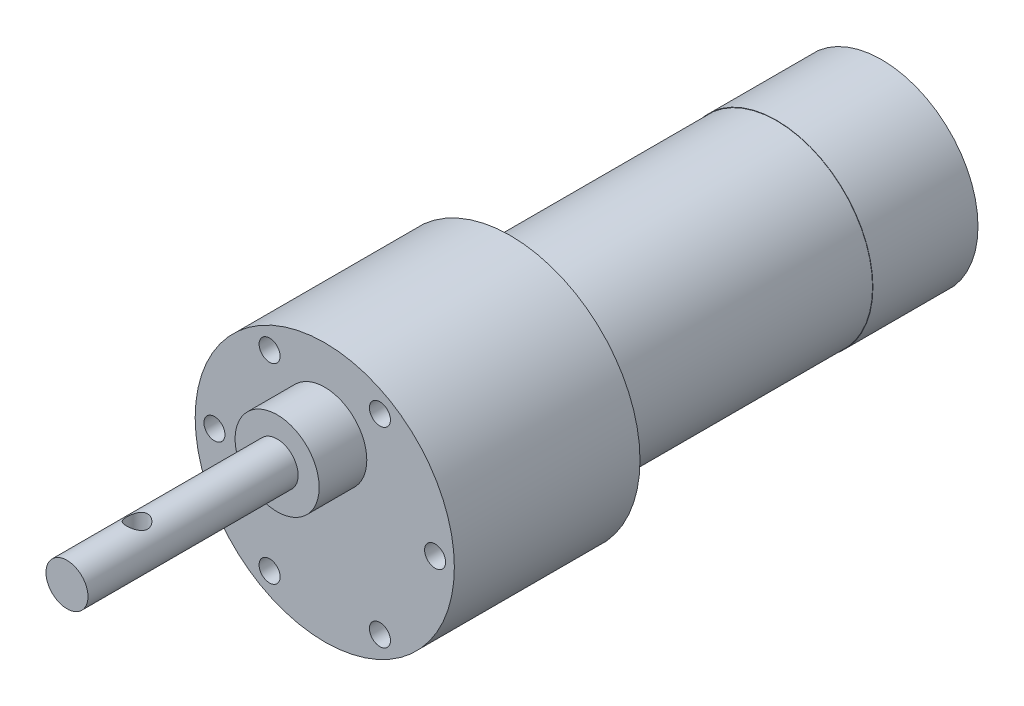
ISO-10303-21;
HEADER;
FILE_DESCRIPTION(('STEP AP214'),'2;1');
FILE_NAME('part.step','',(''),(''),'','','');
FILE_SCHEMA(('AUTOMOTIVE_DESIGN { 1 0 10303 214 1 1 1 1 }'));
ENDSEC;
DATA;
#1=APPLICATION_CONTEXT('core data for automotive mechanical design processes');
#2=APPLICATION_PROTOCOL_DEFINITION('international standard','automotive_design',2000,#1);
#3=PRODUCT_CONTEXT('',#1,'mechanical');
#4=PRODUCT('Part','Part','',(#3));
#5=PRODUCT_RELATED_PRODUCT_CATEGORY('part','',(#4));
#6=PRODUCT_DEFINITION_FORMATION('','',#4);
#7=PRODUCT_DEFINITION_CONTEXT('part definition',#1,'design');
#8=PRODUCT_DEFINITION('design','',#6,#7);
#9=PRODUCT_DEFINITION_SHAPE('','',#8);
#10=(LENGTH_UNIT() NAMED_UNIT(*) SI_UNIT(.MILLI.,.METRE.));
#11=(NAMED_UNIT(*) PLANE_ANGLE_UNIT() SI_UNIT($,.RADIAN.));
#12=(NAMED_UNIT(*) SI_UNIT($,.STERADIAN.) SOLID_ANGLE_UNIT());
#13=UNCERTAINTY_MEASURE_WITH_UNIT(LENGTH_MEASURE(1.E-05),#10,'distance_accuracy_value','');
#14=(GEOMETRIC_REPRESENTATION_CONTEXT(3) GLOBAL_UNCERTAINTY_ASSIGNED_CONTEXT((#13)) GLOBAL_UNIT_ASSIGNED_CONTEXT((#10,
#11,#12)) REPRESENTATION_CONTEXT('',''));
#15=CARTESIAN_POINT('',(0.,0.,0.));
#16=DIRECTION('',(0.,0.,1.));
#17=DIRECTION('',(1.,0.,0.));
#18=AXIS2_PLACEMENT_3D('',#15,#16,#17);
#19=CARTESIAN_POINT('',(0.,7.,63.3));
#20=DIRECTION('',(0.,0.,-1.));
#21=DIRECTION('',(-1.,0.,0.));
#22=AXIS2_PLACEMENT_3D('',#19,#20,#21);
#23=CYLINDRICAL_SURFACE('',#22,3.);
#24=CARTESIAN_POINT('',(0.,4.,51.8));
#25=CARTESIAN_POINT('',(0.07885794442685,4.00000429892438,51.8000049534758));
#26=CARTESIAN_POINT('',(0.157809899546344,4.00314263470365,51.8062551096816));
#27=CARTESIAN_POINT('',(0.313380352903345,4.01538765944264,51.8309793205123));
#28=CARTESIAN_POINT('',(0.389994130070445,4.02450568256621,51.8494765894967));
#29=CARTESIAN_POINT('',(0.538400317320674,4.04775580894937,51.8977907129249));
#30=CARTESIAN_POINT('',(0.61021020440872,4.06186841233694,51.9275635763719));
#31=CARTESIAN_POINT('',(0.747708925209898,4.09381335226358,51.9973559320475));
#32=CARTESIAN_POINT('',(0.813398240985089,4.11164539549712,52.0373746163733));
#33=CARTESIAN_POINT('',(0.941261726642866,4.15065612612907,52.1292758742279));
#34=CARTESIAN_POINT('',(1.00298281668317,4.17197201308694,52.1817297188594));
#35=CARTESIAN_POINT('',(1.11716916730047,4.21510044629886,52.2957822188705));
#36=CARTESIAN_POINT('',(1.16962737466015,4.23691335686448,52.3573877776587));
#37=CARTESIAN_POINT('',(1.26787800067542,4.28051573203979,52.4937250242851));
#38=CARTESIAN_POINT('',(1.31283800332746,4.30217219544802,52.5691041475189));
#39=CARTESIAN_POINT('',(1.38925234033605,4.34071031841519,52.7275510039793));
#40=CARTESIAN_POINT('',(1.4207163224495,4.35759538589516,52.8106131930841));
#41=CARTESIAN_POINT('',(1.46719866328288,4.38313199443287,52.9769976581329));
#42=CARTESIAN_POINT('',(1.48308878562066,4.3922159262443,53.0600066781011));
#43=CARTESIAN_POINT('',(1.50064048996327,4.40227165077209,53.2279682566692));
#44=CARTESIAN_POINT('',(1.50231613255961,4.40325145985068,53.3129188113067));
#45=CARTESIAN_POINT('',(1.49203093075844,4.39733604614127,53.471429036473));
#46=CARTESIAN_POINT('',(1.48167683930523,4.3913685450698,53.5451360468346));
#47=CARTESIAN_POINT('',(1.4504097735854,4.37385656899225,53.6895828640596));
#48=CARTESIAN_POINT('',(1.42949343584648,4.36231031752336,53.760321717958));
#49=CARTESIAN_POINT('',(1.37731467057901,4.33468785380888,53.8988436988485));
#50=CARTESIAN_POINT('',(1.34582260067399,4.31851239004002,53.9665195981787));
#51=CARTESIAN_POINT('',(1.273562531502,4.28344893577895,54.095951438885));
#52=CARTESIAN_POINT('',(1.2327903657187,4.26455972829714,54.1577047034001));
#53=CARTESIAN_POINT('',(1.13709908236919,4.22330263145072,54.2817818791148));
#54=CARTESIAN_POINT('',(1.08104168755393,4.20079734644881,54.3431853103642));
#55=CARTESIAN_POINT('',(0.959333368112064,4.15678565049389,54.4561031278863));
#56=CARTESIAN_POINT('',(0.893677884861432,4.13527972061799,54.5076127880508));
#57=CARTESIAN_POINT('',(0.750774758747775,4.09447019075554,54.6015284915446));
#58=CARTESIAN_POINT('',(0.673130387399114,4.07531523756989,54.6434007086686));
#59=CARTESIAN_POINT('',(0.510699323233193,4.04263178318137,54.7131455435645));
#60=CARTESIAN_POINT('',(0.425918364397911,4.0290988158467,54.7410292775227));
#61=CARTESIAN_POINT('',(0.259149737491051,4.01013499387847,54.779713105575));
#62=CARTESIAN_POINT('',(0.177512295822488,4.00412592548035,54.7917368536202));
#63=CARTESIAN_POINT('',(0.0131693999240274,3.99890479811345,54.8021970967017));
#64=CARTESIAN_POINT('',(-0.0695355298048626,3.99968951918022,54.8006400284592));
#65=CARTESIAN_POINT('',(-0.226849457978981,4.00763211619848,54.7846899673719));
#66=CARTESIAN_POINT('',(-0.301589112074896,4.01429131467748,54.771301200905));
#67=CARTESIAN_POINT('',(-0.447610338452913,4.0326674302774,54.7336428921573));
#68=CARTESIAN_POINT('',(-0.51889152853663,4.04438490498382,54.7093721503198));
#69=CARTESIAN_POINT('',(-0.658332912674359,4.07223622879618,54.6500023003504));
#70=CARTESIAN_POINT('',(-0.726345595508706,4.08848677345554,54.6146134248256));
#71=CARTESIAN_POINT('',(-0.855692042548909,4.12384038523874,54.5343386965301));
#72=CARTESIAN_POINT('',(-0.917022944664889,4.14294466649593,54.4894487981069));
#73=CARTESIAN_POINT('',(-1.03765153393382,4.18437667995703,54.3863593620039));
#74=CARTESIAN_POINT('',(-1.09615811672854,4.20683672734751,54.3272856973323));
#75=CARTESIAN_POINT('',(-1.20278448167828,4.2510641258677,54.2001122730834));
#76=CARTESIAN_POINT('',(-1.25089707856781,4.27283098899929,54.1320063217281));
#77=CARTESIAN_POINT('',(-1.33756187171853,4.31423211690266,53.9845345187405));
#78=CARTESIAN_POINT('',(-1.37553824370037,4.33371205616409,53.9047831008583));
#79=CARTESIAN_POINT('',(-1.43712423890206,4.36638891558798,53.7387348986376));
#80=CARTESIAN_POINT('',(-1.46075237380052,4.37959392667375,53.6524467102997));
#81=CARTESIAN_POINT('',(-1.49079253120031,4.39657748461297,53.4846346656729));
#82=CARTESIAN_POINT('',(-1.49863949460818,4.40113924802403,53.4034486198471));
#83=CARTESIAN_POINT('',(-1.5010337315643,4.40251968037595,53.2408293992532));
#84=CARTESIAN_POINT('',(-1.49558676993486,4.39934170560415,53.1593963468932));
#85=CARTESIAN_POINT('',(-1.47288918838997,4.38643206923385,53.0067747476998));
#86=CARTESIAN_POINT('',(-1.45681247151455,4.37735358276012,52.9353492947829));
#87=CARTESIAN_POINT('',(-1.41476303733662,4.35443475718521,52.7962878208634));
#88=CARTESIAN_POINT('',(-1.38878713673988,4.34059288645497,52.7286530268619));
#89=CARTESIAN_POINT('',(-1.32572361795085,4.30857204453196,52.5940627235202));
#90=CARTESIAN_POINT('',(-1.28800670672355,4.29016416406119,52.5274581472564));
#91=CARTESIAN_POINT('',(-1.20322645745609,4.25147002547709,52.4010881957281));
#92=CARTESIAN_POINT('',(-1.15615825686235,4.23118279306584,52.3413264042183));
#93=CARTESIAN_POINT('',(-1.04730498999206,4.18806515262862,52.222787026468));
#94=CARTESIAN_POINT('',(-0.984426634495895,4.16522525040058,52.1650113464746));
#95=CARTESIAN_POINT('',(-0.849232209349798,4.12183371610104,52.0606055248471));
#96=CARTESIAN_POINT('',(-0.776911084957799,4.10128332060707,52.0139813907951));
#97=CARTESIAN_POINT('',(-0.623897395174421,4.06452985650194,51.9331454559319));
#98=CARTESIAN_POINT('',(-0.543149255665097,4.04835855259101,51.8990237461453));
#99=CARTESIAN_POINT('',(-0.37611315170713,4.0224798805152,51.8452877483639));
#100=CARTESIAN_POINT('',(-0.289841699383651,4.01275414955398,51.8256322297914));
#101=CARTESIAN_POINT('',(-0.168902919736343,4.00456807129783,51.8091538833714));
#102=CARTESIAN_POINT('',(-0.135242819162348,4.00285951989624,51.8057260387005));
#103=CARTESIAN_POINT('',(-0.0677275977076375,4.00057454534777,51.8011480017289));
#104=CARTESIAN_POINT('',(-0.0338724714699428,3.99999815344929,51.7999978722947));
#105=CARTESIAN_POINT('',(0.,4.,51.8));
#106=B_SPLINE_CURVE_WITH_KNOTS('',3,(#24,#25,#26,#27,#28,#29,#30,#31,#32,#33,#34,#35,#36,#37,
#38,#39,#40,#41,#42,#43,#44,#45,#46,#47,#48,#49,#50,#51,#52,#53,#54,#55,#56,#57,#58,#59,#60,#61,
#62,#63,#64,#65,#66,#67,#68,#69,#70,#71,#72,#73,#74,#75,#76,#77,#78,#79,#80,#81,#82,#83,#84,#85,
#86,#87,#88,#89,#90,#91,#92,#93,#94,#95,#96,#97,#98,#99,#100,#101,#102,#103,#104,#105),
.UNSPECIFIED.,.T.,.F.,(4,2,2,2,2,2,2,2,2,2,2,2,2,2,2,2,2,2,2,2,2,2,2,2,2,2,2,2,2,2,2,2,2,2,2,2,
2,2,2,2,4),(0.,0.236436386130439,0.473322224563797,0.709293233238449,0.945245640872353,
1.19547263807714,1.44588935648105,1.71572589646129,1.98536921847422,2.23887018210345,
2.4921203599353,2.71508568613981,2.93812205888518,3.16635360252731,3.39468781890332,
3.65197412000817,3.9093830189803,4.17874533321662,4.4478932536842,4.69474935707019,
4.94148846767214,5.16910359759183,5.39674382446398,5.63089284041848,5.86514176122509,
6.12239415966628,6.37982382923148,6.64972023242588,6.91926767918176,7.1629396125457,
7.40650589797018,7.62686895373284,7.84730293182528,8.08254685170431,8.31791341715446,
8.58187864135757,8.84598575071869,9.1119602049529,9.37717362931724,9.47872920200876,
9.58028757766599),.UNSPECIFIED.);
#107=CARTESIAN_POINT('',(0.,4.,51.8));
#108=VERTEX_POINT('',#107);
#109=EDGE_CURVE('E52',#108,#108,#106,.T.);
#110=ORIENTED_EDGE('',*,*,#109,.F.);
#111=EDGE_LOOP('',(#110));
#112=FACE_BOUND('',#111,.T.);
#113=CARTESIAN_POINT('',(0.,7.,63.3));
#114=DIRECTION('',(0.,0.,1.));
#115=DIRECTION('',(1.,0.,0.));
#116=AXIS2_PLACEMENT_3D('',#113,#114,#115);
#117=CIRCLE('',#116,3.);
#118=CARTESIAN_POINT('',(3.,7.,63.3));
#119=VERTEX_POINT('',#118);
#120=EDGE_CURVE('E147',#119,#119,#117,.T.);
#121=ORIENTED_EDGE('',*,*,#120,.F.);
#122=EDGE_LOOP('',(#121));
#123=FACE_BOUND('',#122,.T.);
#124=CARTESIAN_POINT('',(0.,7.,33.3));
#125=DIRECTION('',(0.,0.,1.));
#126=DIRECTION('',(1.,0.,0.));
#127=AXIS2_PLACEMENT_3D('',#124,#125,#126);
#128=CIRCLE('',#127,3.);
#129=CARTESIAN_POINT('',(3.,7.,33.3));
#130=VERTEX_POINT('',#129);
#131=EDGE_CURVE('E151',#130,#130,#128,.T.);
#132=ORIENTED_EDGE('',*,*,#131,.T.);
#133=EDGE_LOOP('',(#132));
#134=FACE_BOUND('',#133,.T.);
#135=CARTESIAN_POINT('',(0.,10.,51.8));
#136=CARTESIAN_POINT('',(-0.0788579444268501,9.99999570107561,51.8000049534758));
#137=CARTESIAN_POINT('',(-0.157809899546344,9.99685736529634,51.8062551096816));
#138=CARTESIAN_POINT('',(-0.313380352903345,9.98461234055736,51.8309793205123));
#139=CARTESIAN_POINT('',(-0.389994130070445,9.97549431743379,51.8494765894967));
#140=CARTESIAN_POINT('',(-0.538400317320673,9.95224419105063,51.8977907129249));
#141=CARTESIAN_POINT('',(-0.610210204408718,9.93813158766306,51.9275635763719));
#142=CARTESIAN_POINT('',(-0.747708925209896,9.90618664773642,51.9973559320475));
#143=CARTESIAN_POINT('',(-0.813398240985088,9.88835460450288,52.0373746163733));
#144=CARTESIAN_POINT('',(-0.941261726642866,9.84934387387093,52.1292758742279));
#145=CARTESIAN_POINT('',(-1.00298281668317,9.82802798691306,52.1817297188594));
#146=CARTESIAN_POINT('',(-1.11716916730047,9.78489955370114,52.2957822188705));
#147=CARTESIAN_POINT('',(-1.16962737466015,9.76308664313552,52.3573877776587));
#148=CARTESIAN_POINT('',(-1.26787800067542,9.71948426796021,52.4937250242851));
#149=CARTESIAN_POINT('',(-1.31283800332746,9.69782780455198,52.5691041475189));
#150=CARTESIAN_POINT('',(-1.38925234033605,9.65928968158481,52.7275510039793));
#151=CARTESIAN_POINT('',(-1.4207163224495,9.64240461410484,52.8106131930841));
#152=CARTESIAN_POINT('',(-1.46719866328288,9.61686800556713,52.9769976581329));
#153=CARTESIAN_POINT('',(-1.48308878562066,9.6077840737557,53.0600066781011));
#154=CARTESIAN_POINT('',(-1.50064048996327,9.59772834922792,53.2279682566692));
#155=CARTESIAN_POINT('',(-1.50231613255961,9.59674854014932,53.3129188113067));
#156=CARTESIAN_POINT('',(-1.49203093075844,9.60266395385873,53.471429036473));
#157=CARTESIAN_POINT('',(-1.48167683930523,9.6086314549302,53.5451360468346));
#158=CARTESIAN_POINT('',(-1.4504097735854,9.62614343100775,53.6895828640596));
#159=CARTESIAN_POINT('',(-1.42949343584648,9.63768968247664,53.760321717958));
#160=CARTESIAN_POINT('',(-1.37731467057901,9.66531214619111,53.8988436988485));
#161=CARTESIAN_POINT('',(-1.345822600674,9.68148760995998,53.9665195981787));
#162=CARTESIAN_POINT('',(-1.27356253150201,9.71655106422105,54.095951438885));
#163=CARTESIAN_POINT('',(-1.23279036571871,9.73544027170286,54.1577047034001));
#164=CARTESIAN_POINT('',(-1.13709908236919,9.77669736854929,54.2817818791148));
#165=CARTESIAN_POINT('',(-1.08104168755393,9.79920265355119,54.3431853103642));
#166=CARTESIAN_POINT('',(-0.959333368112064,9.84321434950611,54.4561031278863));
#167=CARTESIAN_POINT('',(-0.893677884861432,9.86472027938201,54.5076127880508));
#168=CARTESIAN_POINT('',(-0.750774758747776,9.90552980924446,54.6015284915446));
#169=CARTESIAN_POINT('',(-0.673130387399117,9.92468476243011,54.6434007086686));
#170=CARTESIAN_POINT('',(-0.510699323233198,9.95736821681863,54.7131455435645));
#171=CARTESIAN_POINT('',(-0.425918364397916,9.9709011841533,54.7410292775227));
#172=CARTESIAN_POINT('',(-0.259149737491054,9.98986500612153,54.779713105575));
#173=CARTESIAN_POINT('',(-0.17751229582249,9.99587407451965,54.7917368536202));
#174=CARTESIAN_POINT('',(-0.0131693999240278,10.0010952018866,54.8021970967017));
#175=CARTESIAN_POINT('',(0.0695355298048629,10.0003104808198,54.8006400284592));
#176=CARTESIAN_POINT('',(0.22684945797898,9.99236788380152,54.7846899673719));
#177=CARTESIAN_POINT('',(0.301589112074895,9.98570868532252,54.771301200905));
#178=CARTESIAN_POINT('',(0.447610338452911,9.9673325697226,54.7336428921573));
#179=CARTESIAN_POINT('',(0.518891528536629,9.95561509501618,54.7093721503198));
#180=CARTESIAN_POINT('',(0.658332912674359,9.92776377120382,54.6500023003504));
#181=CARTESIAN_POINT('',(0.726345595508706,9.91151322654446,54.6146134248256));
#182=CARTESIAN_POINT('',(0.855692042548909,9.87615961476127,54.5343386965301));
#183=CARTESIAN_POINT('',(0.917022944664888,9.85705533350407,54.4894487981069));
#184=CARTESIAN_POINT('',(1.03765153393382,9.81562332004297,54.3863593620039));
#185=CARTESIAN_POINT('',(1.09615811672854,9.79316327265249,54.3272856973323));
#186=CARTESIAN_POINT('',(1.20278448167828,9.7489358741323,54.2001122730834));
#187=CARTESIAN_POINT('',(1.25089707856781,9.72716901100071,54.1320063217281));
#188=CARTESIAN_POINT('',(1.33756187171853,9.68576788309734,53.9845345187405));
#189=CARTESIAN_POINT('',(1.37553824370037,9.66628794383591,53.9047831008583));
#190=CARTESIAN_POINT('',(1.43712423890206,9.63361108441202,53.7387348986375));
#191=CARTESIAN_POINT('',(1.46075237380053,9.62040607332625,53.6524467102997));
#192=CARTESIAN_POINT('',(1.49079253120031,9.60342251538703,53.4846346656729));
#193=CARTESIAN_POINT('',(1.49863949460818,9.59886075197597,53.4034486198471));
#194=CARTESIAN_POINT('',(1.5010337315643,9.59748031962405,53.2408293992532));
#195=CARTESIAN_POINT('',(1.49558676993486,9.60065829439585,53.1593963468932));
#196=CARTESIAN_POINT('',(1.47288918838997,9.61356793076615,53.0067747476998));
#197=CARTESIAN_POINT('',(1.45681247151455,9.62264641723987,52.9353492947829));
#198=CARTESIAN_POINT('',(1.41476303733662,9.64556524281479,52.7962878208634));
#199=CARTESIAN_POINT('',(1.38878713673988,9.65940711354503,52.7286530268619));
#200=CARTESIAN_POINT('',(1.32572361795085,9.69142795546804,52.5940627235202));
#201=CARTESIAN_POINT('',(1.28800670672355,9.70983583593881,52.5274581472564));
#202=CARTESIAN_POINT('',(1.20322645745609,9.74852997452291,52.4010881957281));
#203=CARTESIAN_POINT('',(1.15615825686235,9.76881720693416,52.3413264042183));
#204=CARTESIAN_POINT('',(1.04730498999206,9.81193484737138,52.222787026468));
#205=CARTESIAN_POINT('',(0.984426634495894,9.83477474959942,52.1650113464746));
#206=CARTESIAN_POINT('',(0.849232209349798,9.87816628389896,52.0606055248471));
#207=CARTESIAN_POINT('',(0.776911084957799,9.89871667939292,52.0139813907951));
#208=CARTESIAN_POINT('',(0.623897395174421,9.93547014349806,51.9331454559319));
#209=CARTESIAN_POINT('',(0.543149255665097,9.95164144740899,51.8990237461453));
#210=CARTESIAN_POINT('',(0.37611315170713,9.9775201194848,51.8452877483639));
#211=CARTESIAN_POINT('',(0.289841699383651,9.98724585044602,51.8256322297914));
#212=CARTESIAN_POINT('',(0.168902919736343,9.99543192870217,51.8091538833714));
#213=CARTESIAN_POINT('',(0.135242819162347,9.99714048010376,51.8057260387005));
#214=CARTESIAN_POINT('',(0.0677275977076375,9.99942545465223,51.8011480017289));
#215=CARTESIAN_POINT('',(0.0338724714699427,10.0000018465507,51.7999978722947));
#216=CARTESIAN_POINT('',(0.,10.,51.8));
#217=B_SPLINE_CURVE_WITH_KNOTS('',3,(#135,#136,#137,#138,#139,#140,#141,#142,#143,#144,#145,
#146,#147,#148,#149,#150,#151,#152,#153,#154,#155,#156,#157,#158,#159,#160,#161,#162,#163,#164,
#165,#166,#167,#168,#169,#170,#171,#172,#173,#174,#175,#176,#177,#178,#179,#180,#181,#182,#183,
#184,#185,#186,#187,#188,#189,#190,#191,#192,#193,#194,#195,#196,#197,#198,#199,#200,#201,#202,
#203,#204,#205,#206,#207,#208,#209,#210,#211,#212,#213,#214,#215,#216),.UNSPECIFIED.,.T.,.F.,(4,
2,2,2,2,2,2,2,2,2,2,2,2,2,2,2,2,2,2,2,2,2,2,2,2,2,2,2,2,2,2,2,2,2,2,2,2,2,2,2,4),(0.,
0.236436386130439,0.473322224563796,0.709293233238446,0.945245640872353,1.19547263807714,
1.44588935648105,1.71572589646129,1.98536921847422,2.23887018210344,2.4921203599353,
2.71508568613982,2.93812205888518,3.1663536025273,3.39468781890332,3.65197412000817,
3.9093830189803,4.17874533321661,4.4478932536842,4.69474935707019,4.94148846767214,
5.16910359759183,5.39674382446398,5.63089284041848,5.86514176122509,6.12239415966628,
6.37982382923148,6.64972023242589,6.91926767918176,7.1629396125457,7.40650589797018,
7.62686895373284,7.84730293182528,8.08254685170431,8.31791341715446,8.58187864135757,
8.84598575071869,9.1119602049529,9.37717362931724,9.47872920200875,9.58028757766599),.UNSPECIFIED.);
#218=CARTESIAN_POINT('',(0.,10.,51.8));
#219=VERTEX_POINT('',#218);
#220=EDGE_CURVE('E36',#219,#219,#217,.T.);
#221=ORIENTED_EDGE('',*,*,#220,.F.);
#222=EDGE_LOOP('',(#221));
#223=FACE_BOUND('',#222,.T.);
#224=ADVANCED_FACE('F32',(#112,#123,#134,#223),#23,.T.);
#225=CARTESIAN_POINT('',(0.,7.,33.3));
#226=DIRECTION('',(0.,0.,1.));
#227=DIRECTION('',(1.,0.,0.));
#228=AXIS2_PLACEMENT_3D('',#225,#226,#227);
#229=PLANE('',#228);
#230=CARTESIAN_POINT('',(0.,7.,33.3));
#231=DIRECTION('',(0.,0.,1.));
#232=DIRECTION('',(1.,0.,0.));
#233=AXIS2_PLACEMENT_3D('',#230,#231,#232);
#234=CIRCLE('',#233,6.);
#235=CARTESIAN_POINT('',(6.,7.,33.3));
#236=VERTEX_POINT('',#235);
#237=EDGE_CURVE('E203',#236,#236,#234,.T.);
#238=ORIENTED_EDGE('',*,*,#237,.T.);
#239=EDGE_LOOP('',(#238));
#240=FACE_BOUND('',#239,.T.);
#241=ORIENTED_EDGE('',*,*,#131,.F.);
#242=EDGE_LOOP('',(#241));
#243=FACE_BOUND('',#242,.T.);
#244=ADVANCED_FACE('F136',(#240,#243),#229,.T.);
#245=CARTESIAN_POINT('',(0.,0.,26.5));
#246=DIRECTION('',(0.,0.,1.));
#247=DIRECTION('',(1.,0.,0.));
#248=AXIS2_PLACEMENT_3D('',#245,#246,#247);
#249=PLANE('',#248);
#250=CARTESIAN_POINT('',(7.87500000000016,13.6399001096048,26.5));
#251=DIRECTION('',(0.,0.,1.));
#252=DIRECTION('',(0.50000000000001,0.866025403784433,0.));
#253=AXIS2_PLACEMENT_3D('',#250,#251,#252);
#254=CIRCLE('',#253,1.5);
#255=CARTESIAN_POINT('',(8.62500000000018,14.9389382152815,26.5));
#256=VERTEX_POINT('',#255);
#257=EDGE_CURVE('E162',#256,#256,#254,.T.);
#258=ORIENTED_EDGE('',*,*,#257,.F.);
#259=EDGE_LOOP('',(#258));
#260=FACE_BOUND('',#259,.T.);
#261=CARTESIAN_POINT('',(-7.87499999999987,13.639900109605,26.5));
#262=DIRECTION('',(0.,0.,1.));
#263=DIRECTION('',(-0.499999999999992,0.866025403784443,0.));
#264=AXIS2_PLACEMENT_3D('',#261,#262,#263);
#265=CIRCLE('',#264,1.5);
#266=CARTESIAN_POINT('',(-8.62499999999986,14.9389382152816,26.5));
#267=VERTEX_POINT('',#266);
#268=EDGE_CURVE('E168',#267,#267,#265,.T.);
#269=ORIENTED_EDGE('',*,*,#268,.F.);
#270=EDGE_LOOP('',(#269));
#271=FACE_BOUND('',#270,.T.);
#272=CARTESIAN_POINT('',(-15.75,0.,26.5));
#273=DIRECTION('',(0.,0.,1.));
#274=DIRECTION('',(-1.,0.,0.));
#275=AXIS2_PLACEMENT_3D('',#272,#273,#274);
#276=CIRCLE('',#275,1.5);
#277=CARTESIAN_POINT('',(-17.25,0.,26.5));
#278=VERTEX_POINT('',#277);
#279=EDGE_CURVE('E174',#278,#278,#276,.T.);
#280=ORIENTED_EDGE('',*,*,#279,.F.);
#281=EDGE_LOOP('',(#280));
#282=FACE_BOUND('',#281,.T.);
#283=CARTESIAN_POINT('',(-7.87500000000006,-13.6399001096049,26.5));
#284=DIRECTION('',(0.,0.,1.));
#285=DIRECTION('',(-0.500000000000004,-0.866025403784436,0.));
#286=AXIS2_PLACEMENT_3D('',#283,#284,#285);
#287=CIRCLE('',#286,1.5);
#288=CARTESIAN_POINT('',(-8.62500000000007,-14.9389382152815,26.5));
#289=VERTEX_POINT('',#288);
#290=EDGE_CURVE('E180',#289,#289,#287,.T.);
#291=ORIENTED_EDGE('',*,*,#290,.F.);
#292=EDGE_LOOP('',(#291));
#293=FACE_BOUND('',#292,.T.);
#294=CARTESIAN_POINT('',(7.87499999999997,-13.6399001096049,26.5));
#295=DIRECTION('',(0.,0.,1.));
#296=DIRECTION('',(0.499999999999998,-0.86602540378444,0.));
#297=AXIS2_PLACEMENT_3D('',#294,#295,#296);
#298=CIRCLE('',#297,1.5);
#299=CARTESIAN_POINT('',(8.62499999999997,-14.9389382152816,26.5));
#300=VERTEX_POINT('',#299);
#301=EDGE_CURVE('E186',#300,#300,#298,.T.);
#302=ORIENTED_EDGE('',*,*,#301,.F.);
#303=EDGE_LOOP('',(#302));
#304=FACE_BOUND('',#303,.T.);
#305=CARTESIAN_POINT('',(15.75,0.,26.5));
#306=DIRECTION('',(0.,0.,1.));
#307=DIRECTION('',(1.,0.,0.));
#308=AXIS2_PLACEMENT_3D('',#305,#306,#307);
#309=CIRCLE('',#308,1.5);
#310=CARTESIAN_POINT('',(17.25,0.,26.5));
#311=VERTEX_POINT('',#310);
#312=EDGE_CURVE('E192',#311,#311,#309,.T.);
#313=ORIENTED_EDGE('',*,*,#312,.F.);
#314=EDGE_LOOP('',(#313));
#315=FACE_BOUND('',#314,.T.);
#316=CARTESIAN_POINT('',(0.,0.,26.5));
#317=DIRECTION('',(0.,0.,1.));
#318=DIRECTION('',(1.,0.,0.));
#319=AXIS2_PLACEMENT_3D('',#316,#317,#318);
#320=CIRCLE('',#319,18.5);
#321=CARTESIAN_POINT('',(18.5,0.,26.5));
#322=VERTEX_POINT('',#321);
#323=EDGE_CURVE('E44',#322,#322,#320,.T.);
#324=ORIENTED_EDGE('',*,*,#323,.T.);
#325=EDGE_LOOP('',(#324));
#326=FACE_BOUND('',#325,.T.);
#327=CARTESIAN_POINT('',(0.,7.,26.5));
#328=DIRECTION('',(0.,0.,1.));
#329=DIRECTION('',(1.,0.,0.));
#330=AXIS2_PLACEMENT_3D('',#327,#328,#329);
#331=CIRCLE('',#330,6.);
#332=CARTESIAN_POINT('',(6.,7.,26.5));
#333=VERTEX_POINT('',#332);
#334=EDGE_CURVE('E201',#333,#333,#331,.T.);
#335=ORIENTED_EDGE('',*,*,#334,.F.);
#336=EDGE_LOOP('',(#335));
#337=FACE_BOUND('',#336,.T.);
#338=ADVANCED_FACE('F141',(#260,#271,#282,#293,#304,#315,#326,#337),#249,.T.);
#339=CARTESIAN_POINT('',(0.,0.,0.));
#340=DIRECTION('',(0.,0.,1.));
#341=DIRECTION('',(1.,0.,0.));
#342=AXIS2_PLACEMENT_3D('',#339,#340,#341);
#343=PLANE('',#342);
#344=CARTESIAN_POINT('',(0.,0.,0.));
#345=DIRECTION('',(0.,0.,1.));
#346=DIRECTION('',(1.,0.,0.));
#347=AXIS2_PLACEMENT_3D('',#344,#345,#346);
#348=CIRCLE('',#347,18.5);
#349=CARTESIAN_POINT('',(18.5,0.,0.));
#350=VERTEX_POINT('',#349);
#351=EDGE_CURVE('E49',#350,#350,#348,.T.);
#352=ORIENTED_EDGE('',*,*,#351,.F.);
#353=EDGE_LOOP('',(#352));
#354=FACE_BOUND('',#353,.T.);
#355=CARTESIAN_POINT('',(0.,0.,0.));
#356=DIRECTION('',(0.,0.,1.));
#357=DIRECTION('',(1.,0.,0.));
#358=AXIS2_PLACEMENT_3D('',#355,#356,#357);
#359=CIRCLE('',#358,13.7);
#360=CARTESIAN_POINT('',(13.7,0.,0.));
#361=VERTEX_POINT('',#360);
#362=EDGE_CURVE('E10',#361,#361,#359,.F.);
#363=ORIENTED_EDGE('',*,*,#362,.F.);
#364=EDGE_LOOP('',(#363));
#365=FACE_BOUND('',#364,.T.);
#366=ADVANCED_FACE('F216',(#354,#365),#343,.F.);
#367=CARTESIAN_POINT('',(0.,0.,26.5));
#368=DIRECTION('',(0.,0.,-1.));
#369=DIRECTION('',(-1.,0.,0.));
#370=AXIS2_PLACEMENT_3D('',#367,#368,#369);
#371=CYLINDRICAL_SURFACE('',#370,18.5);
#372=ORIENTED_EDGE('',*,*,#323,.F.);
#373=EDGE_LOOP('',(#372));
#374=FACE_BOUND('',#373,.T.);
#375=ORIENTED_EDGE('',*,*,#351,.T.);
#376=EDGE_LOOP('',(#375));
#377=FACE_BOUND('',#376,.T.);
#378=ADVANCED_FACE('F34',(#374,#377),#371,.T.);
#379=CARTESIAN_POINT('',(0.,0.,-38.));
#380=DIRECTION('',(0.,0.,1.));
#381=DIRECTION('',(1.,0.,0.));
#382=AXIS2_PLACEMENT_3D('',#379,#380,#381);
#383=CYLINDRICAL_SURFACE('',#382,13.7);
#384=CARTESIAN_POINT('',(0.,0.,-38.));
#385=DIRECTION('',(0.,0.,-1.));
#386=DIRECTION('',(-1.,0.,0.));
#387=AXIS2_PLACEMENT_3D('',#384,#385,#386);
#388=CIRCLE('',#387,13.7);
#389=CARTESIAN_POINT('',(-13.7,0.,-38.));
#390=VERTEX_POINT('',#389);
#391=EDGE_CURVE('E206',#390,#390,#388,.T.);
#392=ORIENTED_EDGE('',*,*,#391,.F.);
#393=EDGE_LOOP('',(#392));
#394=FACE_BOUND('',#393,.T.);
#395=ORIENTED_EDGE('',*,*,#362,.T.);
#396=EDGE_LOOP('',(#395));
#397=FACE_BOUND('',#396,.T.);
#398=ADVANCED_FACE('F131',(#394,#397),#383,.T.);
#399=CARTESIAN_POINT('',(0.,7.,33.3));
#400=DIRECTION('',(0.,0.,-1.));
#401=DIRECTION('',(-1.,0.,0.));
#402=AXIS2_PLACEMENT_3D('',#399,#400,#401);
#403=CYLINDRICAL_SURFACE('',#402,6.);
#404=ORIENTED_EDGE('',*,*,#237,.F.);
#405=EDGE_LOOP('',(#404));
#406=FACE_BOUND('',#405,.T.);
#407=ORIENTED_EDGE('',*,*,#334,.T.);
#408=EDGE_LOOP('',(#407));
#409=FACE_BOUND('',#408,.T.);
#410=ADVANCED_FACE('F126',(#406,#409),#403,.T.);
#411=CARTESIAN_POINT('',(0.,7.,63.3));
#412=DIRECTION('',(0.,0.,1.));
#413=DIRECTION('',(1.,0.,0.));
#414=AXIS2_PLACEMENT_3D('',#411,#412,#413);
#415=PLANE('',#414);
#416=ORIENTED_EDGE('',*,*,#120,.T.);
#417=EDGE_LOOP('',(#416));
#418=FACE_BOUND('',#417,.T.);
#419=ADVANCED_FACE('F123',(#418),#415,.T.);
#420=CARTESIAN_POINT('',(15.75,0.,20.5));
#421=DIRECTION('',(0.,0.,1.));
#422=DIRECTION('',(1.,0.,0.));
#423=AXIS2_PLACEMENT_3D('',#420,#421,#422);
#424=CYLINDRICAL_SURFACE('',#423,1.5);
#425=CARTESIAN_POINT('',(15.75,0.,20.5));
#426=DIRECTION('',(0.,0.,1.));
#427=DIRECTION('',(1.,0.,0.));
#428=AXIS2_PLACEMENT_3D('',#425,#426,#427);
#429=CIRCLE('',#428,1.5);
#430=CARTESIAN_POINT('',(17.25,0.,20.5));
#431=VERTEX_POINT('',#430);
#432=EDGE_CURVE('E195',#431,#431,#429,.T.);
#433=ORIENTED_EDGE('',*,*,#432,.F.);
#434=EDGE_LOOP('',(#433));
#435=FACE_BOUND('',#434,.T.);
#436=ORIENTED_EDGE('',*,*,#312,.T.);
#437=EDGE_LOOP('',(#436));
#438=FACE_BOUND('',#437,.T.);
#439=ADVANCED_FACE('F120',(#435,#438),#424,.F.);
#440=CARTESIAN_POINT('',(15.75,0.,20.5));
#441=DIRECTION('',(0.,0.,1.));
#442=DIRECTION('',(1.,0.,0.));
#443=AXIS2_PLACEMENT_3D('',#440,#441,#442);
#444=PLANE('',#443);
#445=ORIENTED_EDGE('',*,*,#432,.T.);
#446=EDGE_LOOP('',(#445));
#447=FACE_BOUND('',#446,.T.);
#448=ADVANCED_FACE('F116',(#447),#444,.T.);
#449=CARTESIAN_POINT('',(7.87499999999997,-13.6399001096049,20.5));
#450=DIRECTION('',(0.,0.,1.));
#451=DIRECTION('',(1.,0.,0.));
#452=AXIS2_PLACEMENT_3D('',#449,#450,#451);
#453=CYLINDRICAL_SURFACE('',#452,1.5);
#454=CARTESIAN_POINT('',(7.87499999999997,-13.6399001096049,20.5));
#455=DIRECTION('',(0.,0.,1.));
#456=DIRECTION('',(0.499999999999998,-0.86602540378444,0.));
#457=AXIS2_PLACEMENT_3D('',#454,#455,#456);
#458=CIRCLE('',#457,1.5);
#459=CARTESIAN_POINT('',(8.62499999999997,-14.9389382152816,20.5));
#460=VERTEX_POINT('',#459);
#461=EDGE_CURVE('E189',#460,#460,#458,.T.);
#462=ORIENTED_EDGE('',*,*,#461,.F.);
#463=EDGE_LOOP('',(#462));
#464=FACE_BOUND('',#463,.T.);
#465=ORIENTED_EDGE('',*,*,#301,.T.);
#466=EDGE_LOOP('',(#465));
#467=FACE_BOUND('',#466,.T.);
#468=ADVANCED_FACE('F112',(#464,#467),#453,.F.);
#469=CARTESIAN_POINT('',(7.87499999999997,-13.6399001096049,20.5));
#470=DIRECTION('',(0.,0.,1.));
#471=DIRECTION('',(0.499999999999998,-0.86602540378444,0.));
#472=AXIS2_PLACEMENT_3D('',#469,#470,#471);
#473=PLANE('',#472);
#474=ORIENTED_EDGE('',*,*,#461,.T.);
#475=EDGE_LOOP('',(#474));
#476=FACE_BOUND('',#475,.T.);
#477=ADVANCED_FACE('F108',(#476),#473,.T.);
#478=CARTESIAN_POINT('',(-7.87500000000006,-13.6399001096049,20.5));
#479=DIRECTION('',(0.,0.,1.));
#480=DIRECTION('',(1.,0.,0.));
#481=AXIS2_PLACEMENT_3D('',#478,#479,#480);
#482=CYLINDRICAL_SURFACE('',#481,1.5);
#483=CARTESIAN_POINT('',(-7.87500000000006,-13.6399001096049,20.5));
#484=DIRECTION('',(0.,0.,1.));
#485=DIRECTION('',(-0.500000000000004,-0.866025403784436,0.));
#486=AXIS2_PLACEMENT_3D('',#483,#484,#485);
#487=CIRCLE('',#486,1.5);
#488=CARTESIAN_POINT('',(-8.62500000000007,-14.9389382152815,20.5));
#489=VERTEX_POINT('',#488);
#490=EDGE_CURVE('E183',#489,#489,#487,.T.);
#491=ORIENTED_EDGE('',*,*,#490,.F.);
#492=EDGE_LOOP('',(#491));
#493=FACE_BOUND('',#492,.T.);
#494=ORIENTED_EDGE('',*,*,#290,.T.);
#495=EDGE_LOOP('',(#494));
#496=FACE_BOUND('',#495,.T.);
#497=ADVANCED_FACE('F104',(#493,#496),#482,.F.);
#498=CARTESIAN_POINT('',(-7.87500000000006,-13.6399001096049,20.5));
#499=DIRECTION('',(0.,0.,1.));
#500=DIRECTION('',(-0.500000000000004,-0.866025403784436,0.));
#501=AXIS2_PLACEMENT_3D('',#498,#499,#500);
#502=PLANE('',#501);
#503=ORIENTED_EDGE('',*,*,#490,.T.);
#504=EDGE_LOOP('',(#503));
#505=FACE_BOUND('',#504,.T.);
#506=ADVANCED_FACE('F100',(#505),#502,.T.);
#507=CARTESIAN_POINT('',(-15.75,0.,20.5));
#508=DIRECTION('',(0.,0.,1.));
#509=DIRECTION('',(1.,0.,0.));
#510=AXIS2_PLACEMENT_3D('',#507,#508,#509);
#511=CYLINDRICAL_SURFACE('',#510,1.5);
#512=CARTESIAN_POINT('',(-15.75,0.,20.5));
#513=DIRECTION('',(0.,0.,1.));
#514=DIRECTION('',(-1.,0.,0.));
#515=AXIS2_PLACEMENT_3D('',#512,#513,#514);
#516=CIRCLE('',#515,1.5);
#517=CARTESIAN_POINT('',(-17.25,0.,20.5));
#518=VERTEX_POINT('',#517);
#519=EDGE_CURVE('E177',#518,#518,#516,.T.);
#520=ORIENTED_EDGE('',*,*,#519,.F.);
#521=EDGE_LOOP('',(#520));
#522=FACE_BOUND('',#521,.T.);
#523=ORIENTED_EDGE('',*,*,#279,.T.);
#524=EDGE_LOOP('',(#523));
#525=FACE_BOUND('',#524,.T.);
#526=ADVANCED_FACE('F96',(#522,#525),#511,.F.);
#527=CARTESIAN_POINT('',(-15.75,0.,20.5));
#528=DIRECTION('',(0.,0.,1.));
#529=DIRECTION('',(-1.,0.,0.));
#530=AXIS2_PLACEMENT_3D('',#527,#528,#529);
#531=PLANE('',#530);
#532=ORIENTED_EDGE('',*,*,#519,.T.);
#533=EDGE_LOOP('',(#532));
#534=FACE_BOUND('',#533,.T.);
#535=ADVANCED_FACE('F92',(#534),#531,.T.);
#536=CARTESIAN_POINT('',(-7.87499999999987,13.639900109605,20.5));
#537=DIRECTION('',(0.,0.,1.));
#538=DIRECTION('',(1.,0.,0.));
#539=AXIS2_PLACEMENT_3D('',#536,#537,#538);
#540=CYLINDRICAL_SURFACE('',#539,1.5);
#541=CARTESIAN_POINT('',(-7.87499999999987,13.639900109605,20.5));
#542=DIRECTION('',(0.,0.,1.));
#543=DIRECTION('',(-0.499999999999992,0.866025403784443,0.));
#544=AXIS2_PLACEMENT_3D('',#541,#542,#543);
#545=CIRCLE('',#544,1.5);
#546=CARTESIAN_POINT('',(-8.62499999999986,14.9389382152816,20.5));
#547=VERTEX_POINT('',#546);
#548=EDGE_CURVE('E171',#547,#547,#545,.T.);
#549=ORIENTED_EDGE('',*,*,#548,.F.);
#550=EDGE_LOOP('',(#549));
#551=FACE_BOUND('',#550,.T.);
#552=ORIENTED_EDGE('',*,*,#268,.T.);
#553=EDGE_LOOP('',(#552));
#554=FACE_BOUND('',#553,.T.);
#555=ADVANCED_FACE('F88',(#551,#554),#540,.F.);
#556=CARTESIAN_POINT('',(-7.87499999999987,13.639900109605,20.5));
#557=DIRECTION('',(0.,0.,1.));
#558=DIRECTION('',(-0.499999999999992,0.866025403784443,0.));
#559=AXIS2_PLACEMENT_3D('',#556,#557,#558);
#560=PLANE('',#559);
#561=ORIENTED_EDGE('',*,*,#548,.T.);
#562=EDGE_LOOP('',(#561));
#563=FACE_BOUND('',#562,.T.);
#564=ADVANCED_FACE('F84',(#563),#560,.T.);
#565=CARTESIAN_POINT('',(7.87500000000016,13.6399001096048,20.5));
#566=DIRECTION('',(0.,0.,1.));
#567=DIRECTION('',(1.,0.,0.));
#568=AXIS2_PLACEMENT_3D('',#565,#566,#567);
#569=CYLINDRICAL_SURFACE('',#568,1.5);
#570=CARTESIAN_POINT('',(7.87500000000016,13.6399001096048,20.5));
#571=DIRECTION('',(0.,0.,1.));
#572=DIRECTION('',(0.50000000000001,0.866025403784433,0.));
#573=AXIS2_PLACEMENT_3D('',#570,#571,#572);
#574=CIRCLE('',#573,1.5);
#575=CARTESIAN_POINT('',(8.62500000000018,14.9389382152815,20.5));
#576=VERTEX_POINT('',#575);
#577=EDGE_CURVE('E165',#576,#576,#574,.T.);
#578=ORIENTED_EDGE('',*,*,#577,.F.);
#579=EDGE_LOOP('',(#578));
#580=FACE_BOUND('',#579,.T.);
#581=ORIENTED_EDGE('',*,*,#257,.T.);
#582=EDGE_LOOP('',(#581));
#583=FACE_BOUND('',#582,.T.);
#584=ADVANCED_FACE('F80',(#580,#583),#569,.F.);
#585=CARTESIAN_POINT('',(7.87500000000016,13.6399001096048,20.5));
#586=DIRECTION('',(0.,0.,1.));
#587=DIRECTION('',(0.50000000000001,0.866025403784433,0.));
#588=AXIS2_PLACEMENT_3D('',#585,#586,#587);
#589=PLANE('',#588);
#590=ORIENTED_EDGE('',*,*,#577,.T.);
#591=EDGE_LOOP('',(#590));
#592=FACE_BOUND('',#591,.T.);
#593=ADVANCED_FACE('F73',(#592),#589,.T.);
#594=CARTESIAN_POINT('',(0.,0.,-38.));
#595=DIRECTION('',(0.,0.,-1.));
#596=DIRECTION('',(-1.,0.,0.));
#597=AXIS2_PLACEMENT_3D('',#594,#595,#596);
#598=PLANE('',#597);
#599=CARTESIAN_POINT('',(0.,0.,-38.));
#600=DIRECTION('',(0.,0.,-1.));
#601=DIRECTION('',(-1.,0.,0.));
#602=AXIS2_PLACEMENT_3D('',#599,#600,#601);
#603=CIRCLE('',#602,13.75);
#604=CARTESIAN_POINT('',(-13.75,0.,-38.));
#605=VERTEX_POINT('',#604);
#606=EDGE_CURVE('E155',#605,#605,#603,.T.);
#607=ORIENTED_EDGE('',*,*,#606,.F.);
#608=EDGE_LOOP('',(#607));
#609=FACE_BOUND('',#608,.T.);
#610=ORIENTED_EDGE('',*,*,#391,.T.);
#611=EDGE_LOOP('',(#610));
#612=FACE_BOUND('',#611,.T.);
#613=ADVANCED_FACE('F70',(#609,#612),#598,.F.);
#614=CARTESIAN_POINT('',(0.,0.,-53.));
#615=DIRECTION('',(0.,0.,1.));
#616=DIRECTION('',(1.,0.,0.));
#617=AXIS2_PLACEMENT_3D('',#614,#615,#616);
#618=CYLINDRICAL_SURFACE('',#617,13.75);
#619=CARTESIAN_POINT('',(0.,0.,-53.));
#620=DIRECTION('',(0.,0.,-1.));
#621=DIRECTION('',(-1.,0.,0.));
#622=AXIS2_PLACEMENT_3D('',#619,#620,#621);
#623=CIRCLE('',#622,13.75);
#624=CARTESIAN_POINT('',(-13.75,0.,-53.));
#625=VERTEX_POINT('',#624);
#626=EDGE_CURVE('E157',#625,#625,#623,.T.);
#627=ORIENTED_EDGE('',*,*,#626,.F.);
#628=EDGE_LOOP('',(#627));
#629=FACE_BOUND('',#628,.T.);
#630=ORIENTED_EDGE('',*,*,#606,.T.);
#631=EDGE_LOOP('',(#630));
#632=FACE_BOUND('',#631,.T.);
#633=ADVANCED_FACE('F68',(#629,#632),#618,.T.);
#634=CARTESIAN_POINT('',(0.,0.,-53.));
#635=DIRECTION('',(0.,0.,-1.));
#636=DIRECTION('',(-1.,0.,0.));
#637=AXIS2_PLACEMENT_3D('',#634,#635,#636);
#638=PLANE('',#637);
#639=ORIENTED_EDGE('',*,*,#626,.T.);
#640=EDGE_LOOP('',(#639));
#641=FACE_BOUND('',#640,.T.);
#642=ADVANCED_FACE('F63',(#641),#638,.T.);
#643=CARTESIAN_POINT('',(0.,18.5,53.3));
#644=DIRECTION('',(0.,-1.,0.));
#645=DIRECTION('',(0.,0.,-1.));
#646=AXIS2_PLACEMENT_3D('',#643,#644,#645);
#647=CYLINDRICAL_SURFACE('',#646,1.5);
#648=ORIENTED_EDGE('',*,*,#109,.T.);
#649=EDGE_LOOP('',(#648));
#650=FACE_BOUND('',#649,.T.);
#651=ORIENTED_EDGE('',*,*,#220,.T.);
#652=EDGE_LOOP('',(#651));
#653=FACE_BOUND('',#652,.T.);
#654=ADVANCED_FACE('F59',(#650,#653),#647,.F.);
#655=CLOSED_SHELL('',(#224,#244,#338,#366,#378,#398,#410,#419,#439,#448,#468,#477,#497,#506,
#526,#535,#555,#564,#584,#593,#613,#633,#642,#654));
#656=MANIFOLD_SOLID_BREP('B2',#655);
#657=ADVANCED_BREP_SHAPE_REPRESENTATION('',(#18,#656),#14);
#658=SHAPE_DEFINITION_REPRESENTATION(#9,#657);
ENDSEC;
END-ISO-10303-21;
